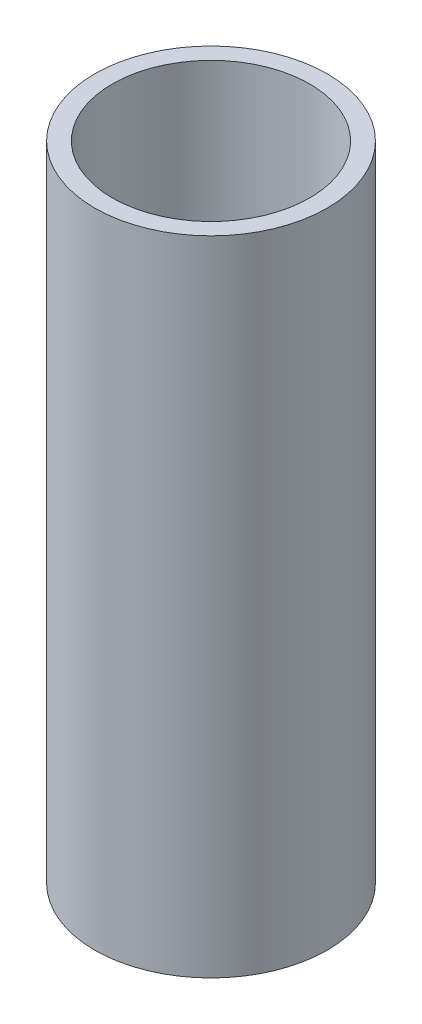
ISO-10303-21;
HEADER;
FILE_DESCRIPTION(('STEP AP214'),'2;1');
FILE_NAME('part.step','',(''),(''),'','','');
FILE_SCHEMA(('AUTOMOTIVE_DESIGN { 1 0 10303 214 1 1 1 1 }'));
ENDSEC;
DATA;
#1=APPLICATION_CONTEXT('core data for automotive mechanical design processes');
#2=APPLICATION_PROTOCOL_DEFINITION('international standard','automotive_design',2000,#1);
#3=PRODUCT_CONTEXT('',#1,'mechanical');
#4=PRODUCT('Part','Part','',(#3));
#5=PRODUCT_RELATED_PRODUCT_CATEGORY('part','',(#4));
#6=PRODUCT_DEFINITION_FORMATION('','',#4);
#7=PRODUCT_DEFINITION_CONTEXT('part definition',#1,'design');
#8=PRODUCT_DEFINITION('design','',#6,#7);
#9=PRODUCT_DEFINITION_SHAPE('','',#8);
#10=(LENGTH_UNIT() NAMED_UNIT(*) SI_UNIT(.MILLI.,.METRE.));
#11=(NAMED_UNIT(*) PLANE_ANGLE_UNIT() SI_UNIT($,.RADIAN.));
#12=(NAMED_UNIT(*) SI_UNIT($,.STERADIAN.) SOLID_ANGLE_UNIT());
#13=UNCERTAINTY_MEASURE_WITH_UNIT(LENGTH_MEASURE(1.E-05),#10,'distance_accuracy_value','');
#14=(GEOMETRIC_REPRESENTATION_CONTEXT(3) GLOBAL_UNCERTAINTY_ASSIGNED_CONTEXT((#13)) GLOBAL_UNIT_ASSIGNED_CONTEXT((#10,
#11,#12)) REPRESENTATION_CONTEXT('',''));
#15=CARTESIAN_POINT('',(0.,0.,0.));
#16=DIRECTION('',(0.,0.,1.));
#17=DIRECTION('',(1.,0.,0.));
#18=AXIS2_PLACEMENT_3D('',#15,#16,#17);
#19=CARTESIAN_POINT('',(0.,55.,0.));
#20=DIRECTION('',(0.,-1.,0.));
#21=DIRECTION('',(0.,0.,-1.));
#22=AXIS2_PLACEMENT_3D('',#19,#20,#21);
#23=CYLINDRICAL_SURFACE('',#22,19.9);
#24=CARTESIAN_POINT('',(0.,55.,0.));
#25=DIRECTION('',(0.,1.,0.));
#26=DIRECTION('',(0.,0.,1.));
#27=AXIS2_PLACEMENT_3D('',#24,#25,#26);
#28=CIRCLE('',#27,19.9);
#29=CARTESIAN_POINT('',(0.,55.,19.9));
#30=VERTEX_POINT('',#29);
#31=EDGE_CURVE('E10',#30,#30,#28,.T.);
#32=ORIENTED_EDGE('',*,*,#31,.F.);
#33=EDGE_LOOP('',(#32));
#34=FACE_BOUND('',#33,.T.);
#35=CARTESIAN_POINT('',(0.,-55.,0.));
#36=DIRECTION('',(0.,1.,0.));
#37=DIRECTION('',(0.,0.,1.));
#38=AXIS2_PLACEMENT_3D('',#35,#36,#37);
#39=CIRCLE('',#38,19.9);
#40=CARTESIAN_POINT('',(0.,-55.,19.9));
#41=VERTEX_POINT('',#40);
#42=EDGE_CURVE('E51',#41,#41,#39,.T.);
#43=ORIENTED_EDGE('',*,*,#42,.T.);
#44=EDGE_LOOP('',(#43));
#45=FACE_BOUND('',#44,.T.);
#46=ADVANCED_FACE('F43',(#34,#45),#23,.T.);
#47=CARTESIAN_POINT('',(0.,55.,0.));
#48=DIRECTION('',(0.,1.,0.));
#49=DIRECTION('',(0.,0.,1.));
#50=AXIS2_PLACEMENT_3D('',#47,#48,#49);
#51=PLANE('',#50);
#52=CARTESIAN_POINT('',(0.,55.,0.));
#53=DIRECTION('',(0.,1.,0.));
#54=DIRECTION('',(0.,0.,1.));
#55=AXIS2_PLACEMENT_3D('',#52,#53,#54);
#56=CIRCLE('',#55,16.9);
#57=CARTESIAN_POINT('',(0.,55.,16.9));
#58=VERTEX_POINT('',#57);
#59=EDGE_CURVE('E58',#58,#58,#56,.T.);
#60=ORIENTED_EDGE('',*,*,#59,.F.);
#61=EDGE_LOOP('',(#60));
#62=FACE_BOUND('',#61,.T.);
#63=ORIENTED_EDGE('',*,*,#31,.T.);
#64=EDGE_LOOP('',(#63));
#65=FACE_BOUND('',#64,.T.);
#66=ADVANCED_FACE('F76',(#62,#65),#51,.T.);
#67=CARTESIAN_POINT('',(0.,-55.,0.));
#68=DIRECTION('',(0.,1.,0.));
#69=DIRECTION('',(0.,0.,1.));
#70=AXIS2_PLACEMENT_3D('',#67,#68,#69);
#71=PLANE('',#70);
#72=CARTESIAN_POINT('',(0.,-55.,0.));
#73=DIRECTION('',(0.,1.,0.));
#74=DIRECTION('',(0.,0.,1.));
#75=AXIS2_PLACEMENT_3D('',#72,#73,#74);
#76=CIRCLE('',#75,16.9);
#77=CARTESIAN_POINT('',(0.,-55.,16.9));
#78=VERTEX_POINT('',#77);
#79=EDGE_CURVE('E46',#78,#78,#76,.T.);
#80=ORIENTED_EDGE('',*,*,#79,.T.);
#81=EDGE_LOOP('',(#80));
#82=FACE_BOUND('',#81,.T.);
#83=ORIENTED_EDGE('',*,*,#42,.F.);
#84=EDGE_LOOP('',(#83));
#85=FACE_BOUND('',#84,.T.);
#86=ADVANCED_FACE('F67',(#82,#85),#71,.F.);
#87=CARTESIAN_POINT('',(0.,-68.,0.));
#88=DIRECTION('',(0.,1.,0.));
#89=DIRECTION('',(0.,0.,1.));
#90=AXIS2_PLACEMENT_3D('',#87,#88,#89);
#91=CYLINDRICAL_SURFACE('',#90,16.9);
#92=ORIENTED_EDGE('',*,*,#59,.T.);
#93=EDGE_LOOP('',(#92));
#94=FACE_BOUND('',#93,.T.);
#95=ORIENTED_EDGE('',*,*,#79,.F.);
#96=EDGE_LOOP('',(#95));
#97=FACE_BOUND('',#96,.T.);
#98=ADVANCED_FACE('F70',(#94,#97),#91,.F.);
#99=CLOSED_SHELL('',(#46,#66,#86,#98));
#100=MANIFOLD_SOLID_BREP('B2',#99);
#101=ADVANCED_BREP_SHAPE_REPRESENTATION('',(#18,#100),#14);
#102=SHAPE_DEFINITION_REPRESENTATION(#9,#101);
ENDSEC;
END-ISO-10303-21;
